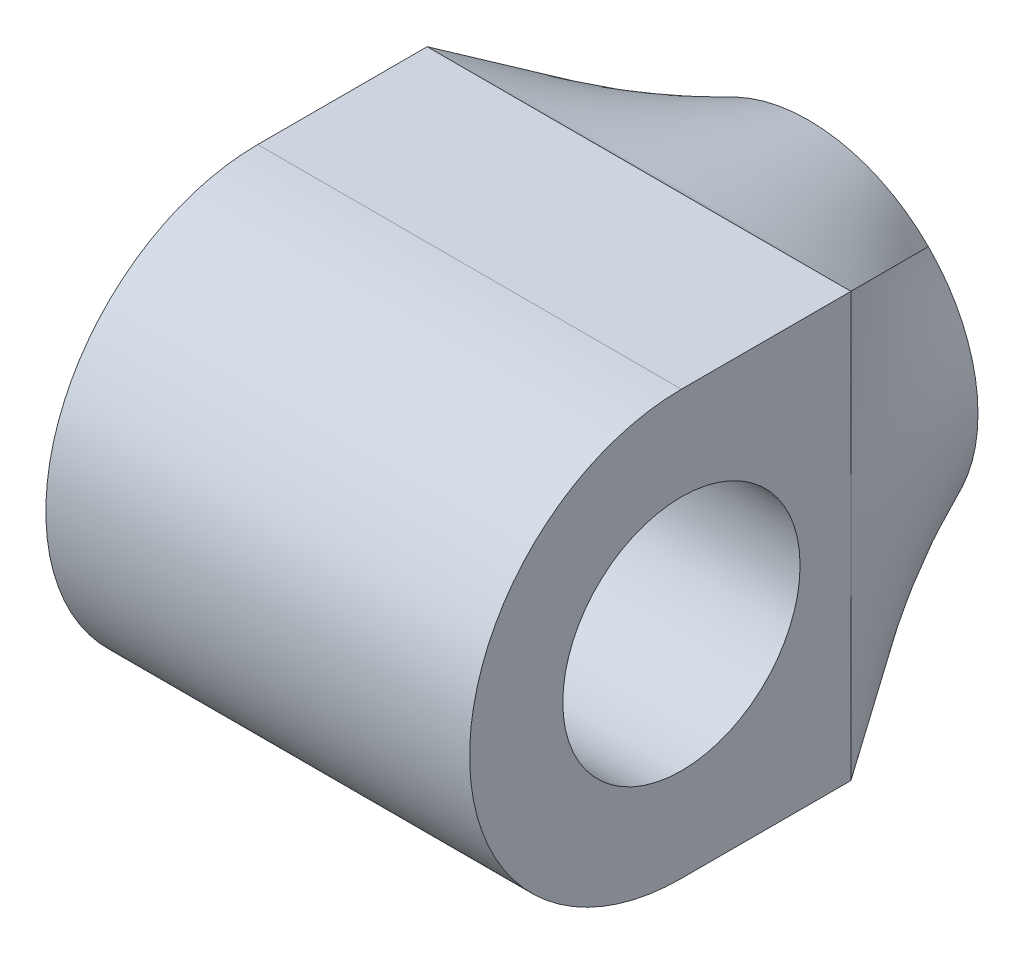
ISO-10303-21;
HEADER;
FILE_DESCRIPTION(('STEP AP214'),'2;1');
FILE_NAME('part.step','',(''),(''),'','','');
FILE_SCHEMA(('AUTOMOTIVE_DESIGN { 1 0 10303 214 1 1 1 1 }'));
ENDSEC;
DATA;
#1=APPLICATION_CONTEXT('core data for automotive mechanical design processes');
#2=APPLICATION_PROTOCOL_DEFINITION('international standard','automotive_design',2000,#1);
#3=PRODUCT_CONTEXT('',#1,'mechanical');
#4=PRODUCT('Part','Part','',(#3));
#5=PRODUCT_RELATED_PRODUCT_CATEGORY('part','',(#4));
#6=PRODUCT_DEFINITION_FORMATION('','',#4);
#7=PRODUCT_DEFINITION_CONTEXT('part definition',#1,'design');
#8=PRODUCT_DEFINITION('design','',#6,#7);
#9=PRODUCT_DEFINITION_SHAPE('','',#8);
#10=(LENGTH_UNIT() NAMED_UNIT(*) SI_UNIT(.MILLI.,.METRE.));
#11=(NAMED_UNIT(*) PLANE_ANGLE_UNIT() SI_UNIT($,.RADIAN.));
#12=(NAMED_UNIT(*) SI_UNIT($,.STERADIAN.) SOLID_ANGLE_UNIT());
#13=UNCERTAINTY_MEASURE_WITH_UNIT(LENGTH_MEASURE(1.E-05),#10,'distance_accuracy_value','');
#14=(GEOMETRIC_REPRESENTATION_CONTEXT(3) GLOBAL_UNCERTAINTY_ASSIGNED_CONTEXT((#13)) GLOBAL_UNIT_ASSIGNED_CONTEXT((#10,
#11,#12)) REPRESENTATION_CONTEXT('',''));
#15=CARTESIAN_POINT('',(0.,0.,0.));
#16=DIRECTION('',(0.,0.,1.));
#17=DIRECTION('',(1.,0.,0.));
#18=AXIS2_PLACEMENT_3D('',#15,#16,#17);
#19=CARTESIAN_POINT('',(0.,0.,0.));
#20=DIRECTION('',(0.,0.,1.));
#21=DIRECTION('',(1.,0.,0.));
#22=AXIS2_PLACEMENT_3D('',#19,#20,#21);
#23=PLANE('',#22);
#24=CARTESIAN_POINT('',(0.,0.,0.));
#25=DIRECTION('',(0.,0.,1.));
#26=DIRECTION('',(1.,0.,0.));
#27=AXIS2_PLACEMENT_3D('',#24,#25,#26);
#28=CIRCLE('',#27,10.);
#29=CARTESIAN_POINT('',(-7.07106781186548,-7.07106781186548,0.));
#30=VERTEX_POINT('',#29);
#31=CARTESIAN_POINT('',(7.07106781186547,-7.07106781186548,0.));
#32=VERTEX_POINT('',#31);
#33=EDGE_CURVE('E12',#30,#32,#28,.T.);
#34=ORIENTED_EDGE('',*,*,#33,.F.);
#35=CARTESIAN_POINT('',(-7.07106781186548,7.07106781186548,0.));
#36=VERTEX_POINT('',#35);
#37=EDGE_CURVE('E279',#36,#30,#28,.T.);
#38=ORIENTED_EDGE('',*,*,#37,.F.);
#39=CARTESIAN_POINT('',(7.07106781186548,7.07106781186548,0.));
#40=VERTEX_POINT('',#39);
#41=EDGE_CURVE('E281',#40,#36,#28,.T.);
#42=ORIENTED_EDGE('',*,*,#41,.F.);
#43=EDGE_CURVE('E80',#32,#40,#28,.T.);
#44=ORIENTED_EDGE('',*,*,#43,.F.);
#45=EDGE_LOOP('',(#34,#38,#42,#44));
#46=FACE_BOUND('',#45,.T.);
#47=ADVANCED_FACE('F70',(#46),#23,.F.);
#48=CARTESIAN_POINT('',(-12.5,12.5,10.));
#49=CARTESIAN_POINT('',(-7.07106781186548,7.07106781186548,0.));
#50=CARTESIAN_POINT('',(-11.4583333333333,12.5,10.));
#51=CARTESIAN_POINT('',(-6.65440114519881,7.48773447853214,0.));
#52=CARTESIAN_POINT('',(-10.4166666666667,12.5,10.));
#53=CARTESIAN_POINT('',(-6.18511190982561,7.88294229636119,0.));
#54=CARTESIAN_POINT('',(-8.33333333333333,12.5,10.));
#55=CARTESIAN_POINT('',(-5.1475798041437,8.59644174904935,0.));
#56=CARTESIAN_POINT('',(-7.29166666666666,12.5,10.));
#57=CARTESIAN_POINT('',(-4.57928394964498,8.91450237104858,0.));
#58=CARTESIAN_POINT('',(-5.20833333333333,12.5,10.));
#59=CARTESIAN_POINT('',(-3.36426300033644,9.44033518893656,0.));
#60=CARTESIAN_POINT('',(-4.16666666666666,12.5,10.));
#61=CARTESIAN_POINT('',(-2.71763303055414,9.64784964914939,0.));
#62=CARTESIAN_POINT('',(-2.08333333333333,12.5,10.));
#63=CARTESIAN_POINT('',(-1.380556458553,9.92776893395985,0.));
#64=CARTESIAN_POINT('',(-1.04166666666666,12.5,10.));
#65=CARTESIAN_POINT('',(-0.690355937288492,10.,0.));
#66=CARTESIAN_POINT('',(1.04166666666667,12.5,10.));
#67=CARTESIAN_POINT('',(0.690355937288492,10.,0.));
#68=CARTESIAN_POINT('',(2.08333333333334,12.5,10.));
#69=CARTESIAN_POINT('',(1.380556458553,9.92776893395986,0.));
#70=CARTESIAN_POINT('',(4.16666666666667,12.5,10.));
#71=CARTESIAN_POINT('',(2.71763303055414,9.64784964914939,0.));
#72=CARTESIAN_POINT('',(5.20833333333334,12.5,10.));
#73=CARTESIAN_POINT('',(3.36426300033644,9.44033518893657,0.));
#74=CARTESIAN_POINT('',(7.29166666666667,12.5,10.));
#75=CARTESIAN_POINT('',(4.57928394964498,8.91450237104858,0.));
#76=CARTESIAN_POINT('',(8.33333333333334,12.5,10.));
#77=CARTESIAN_POINT('',(5.14757980414371,8.59644174904935,0.));
#78=CARTESIAN_POINT('',(10.4166666666667,12.5,10.));
#79=CARTESIAN_POINT('',(6.18511190982561,7.88294229636119,0.));
#80=CARTESIAN_POINT('',(11.4583333333333,12.5,10.));
#81=CARTESIAN_POINT('',(6.65440114519881,7.48773447853215,0.));
#82=CARTESIAN_POINT('',(12.5,12.5,10.));
#83=CARTESIAN_POINT('',(7.07106781186548,7.07106781186548,0.));
#84=B_SPLINE_SURFACE_WITH_KNOTS('',3,1,((#48,#49),(#50,#51),(#52,#53),(#54,#55),(#56,#57),(#58,
#59),(#60,#61),(#62,#63),(#64,#65),(#66,#67),(#68,#69),(#70,#71),(#72,#73),(#74,#75),(#76,#77),
(#78,#79),(#80,#81),(#82,#83)),.UNSPECIFIED.,.F.,.F.,.F.,(4,2,2,2,2,2,2,2,4),(2,2),(0.,0.125,
0.25,0.375,0.5,0.625,0.75,0.875,1.),(0.,1.),.UNSPECIFIED.);
#85=DIRECTION('',(-1.,0.,0.));
#86=VECTOR('',#85,1.);
#87=CARTESIAN_POINT('',(-12.5,12.5,10.));
#88=LINE('',#87,#86);
#89=CARTESIAN_POINT('',(12.5008428006911,12.5,10.));
#90=VERTEX_POINT('',#89);
#91=CARTESIAN_POINT('',(-12.5008428006911,12.5,10.));
#92=VERTEX_POINT('',#91);
#93=EDGE_CURVE('E149',#90,#92,#88,.T.);
#94=DIRECTION('',(-0.430614632146905,-0.430614632146906,-0.793184768614457));
#95=VECTOR('',#94,1.);
#96=CARTESIAN_POINT('',(9.78553390593274,9.78553390593274,5.));
#97=LINE('',#96,#95);
#98=EDGE_CURVE('E247',#90,#40,#97,.T.);
#99=DIRECTION('',(-0.430614632146906,0.430614632146906,0.793184768614457));
#100=VECTOR('',#99,1.);
#101=CARTESIAN_POINT('',(-9.78553390593274,9.78553390593274,5.));
#102=LINE('',#101,#100);
#103=EDGE_CURVE('E249',#36,#92,#102,.T.);
#104=CARTESIAN_POINT('',(-12.50105,12.5,10.));
#105=CARTESIAN_POINT('',(-7.07148781186548,7.07064781186548,0.));
#106=CARTESIAN_POINT('',(-12.5007,12.5,10.));
#107=CARTESIAN_POINT('',(-7.07134781186548,7.07078781186548,0.));
#108=CARTESIAN_POINT('',(-12.50035,12.5,10.));
#109=CARTESIAN_POINT('',(-7.07120781186548,7.07092781186548,0.));
#110=CARTESIAN_POINT('',(-12.5,12.5,10.));
#111=CARTESIAN_POINT('',(-7.07106781186548,7.07106781186548,0.));
#112=CARTESIAN_POINT('',(-11.4583333333333,12.5,10.));
#113=CARTESIAN_POINT('',(-6.65440114519881,7.48773447853214,0.));
#114=CARTESIAN_POINT('',(-10.4166666666667,12.5,10.));
#115=CARTESIAN_POINT('',(-6.18511190982561,7.88294229636119,0.));
#116=CARTESIAN_POINT('',(-8.33333333333333,12.5,10.));
#117=CARTESIAN_POINT('',(-5.1475798041437,8.59644174904935,0.));
#118=CARTESIAN_POINT('',(-7.29166666666666,12.5,10.));
#119=CARTESIAN_POINT('',(-4.57928394964498,8.91450237104858,0.));
#120=CARTESIAN_POINT('',(-5.20833333333333,12.5,10.));
#121=CARTESIAN_POINT('',(-3.36426300033644,9.44033518893656,0.));
#122=CARTESIAN_POINT('',(-4.16666666666666,12.5,10.));
#123=CARTESIAN_POINT('',(-2.71763303055414,9.64784964914939,0.));
#124=CARTESIAN_POINT('',(-2.08333333333333,12.5,10.));
#125=CARTESIAN_POINT('',(-1.380556458553,9.92776893395985,0.));
#126=CARTESIAN_POINT('',(-1.04166666666666,12.5,10.));
#127=CARTESIAN_POINT('',(-0.690355937288492,10.,0.));
#128=CARTESIAN_POINT('',(1.04166666666667,12.5,10.));
#129=CARTESIAN_POINT('',(0.690355937288492,10.,0.));
#130=CARTESIAN_POINT('',(2.08333333333334,12.5,10.));
#131=CARTESIAN_POINT('',(1.380556458553,9.92776893395986,0.));
#132=CARTESIAN_POINT('',(4.16666666666667,12.5,10.));
#133=CARTESIAN_POINT('',(2.71763303055414,9.64784964914939,0.));
#134=CARTESIAN_POINT('',(5.20833333333334,12.5,10.));
#135=CARTESIAN_POINT('',(3.36426300033644,9.44033518893657,0.));
#136=CARTESIAN_POINT('',(7.29166666666667,12.5,10.));
#137=CARTESIAN_POINT('',(4.57928394964498,8.91450237104858,0.));
#138=CARTESIAN_POINT('',(8.33333333333334,12.5,10.));
#139=CARTESIAN_POINT('',(5.14757980414371,8.59644174904935,0.));
#140=CARTESIAN_POINT('',(10.4166666666667,12.5,10.));
#141=CARTESIAN_POINT('',(6.18511190982561,7.88294229636119,0.));
#142=CARTESIAN_POINT('',(11.4583333333333,12.5,10.));
#143=CARTESIAN_POINT('',(6.65440114519881,7.48773447853215,0.));
#144=CARTESIAN_POINT('',(12.5,12.5,10.));
#145=CARTESIAN_POINT('',(7.07106781186548,7.07106781186548,0.));
#146=CARTESIAN_POINT('',(12.50035,12.5,10.));
#147=CARTESIAN_POINT('',(7.07120781186548,7.07092781186548,0.));
#148=CARTESIAN_POINT('',(12.5007,12.5,10.));
#149=CARTESIAN_POINT('',(7.07134781186548,7.07078781186548,0.));
#150=CARTESIAN_POINT('',(12.50105,12.5,10.));
#151=CARTESIAN_POINT('',(7.07148781186548,7.07064781186548,0.));
#152=B_SPLINE_SURFACE_WITH_KNOTS('',3,1,((#104,#105),(#106,#107),(#108,#109),(#110,#111),(#112,
#113),(#114,#115),(#116,#117),(#118,#119),(#120,#121),(#122,#123),(#124,#125),(#126,#127),(#128,
#129),(#130,#131),(#132,#133),(#134,#135),(#136,#137),(#138,#139),(#140,#141),(#142,#143),(#144,
#145),(#146,#147),(#148,#149),(#150,#151)),.UNSPECIFIED.,.F.,.F.,.F.,(4,3,2,2,2,2,2,2,2,3,4),(2,
2),(-4.2E-05,0.,0.125,0.25,0.375,0.5,0.625,0.75,0.875,1.,1.000042),(0.,1.),.UNSPECIFIED.);
#153=ORIENTED_EDGE('',*,*,#93,.F.);
#154=ORIENTED_EDGE('',*,*,#98,.T.);
#155=ORIENTED_EDGE('',*,*,#41,.T.);
#156=ORIENTED_EDGE('',*,*,#103,.T.);
#157=EDGE_LOOP('',(#153,#154,#155,#156));
#158=FACE_BOUND('',#157,.T.);
#159=ADVANCED_FACE('F223',(#158),#152,.T.);
#160=CARTESIAN_POINT('',(12.5,12.5,10.));
#161=CARTESIAN_POINT('',(7.07106781186548,7.07106781186548,0.));
#162=CARTESIAN_POINT('',(12.5,11.4583333333333,10.));
#163=CARTESIAN_POINT('',(7.48773447853215,6.65440114519881,0.));
#164=CARTESIAN_POINT('',(12.5,10.4166666666667,10.));
#165=CARTESIAN_POINT('',(7.8829422963612,6.18511190982561,0.));
#166=CARTESIAN_POINT('',(12.5,8.33333333333334,10.));
#167=CARTESIAN_POINT('',(8.59644174904935,5.14757980414371,0.));
#168=CARTESIAN_POINT('',(12.5,7.29166666666667,10.));
#169=CARTESIAN_POINT('',(8.91450237104858,4.57928394964498,0.));
#170=CARTESIAN_POINT('',(12.5,5.20833333333334,10.));
#171=CARTESIAN_POINT('',(9.44033518893657,3.36426300033644,0.));
#172=CARTESIAN_POINT('',(12.5,4.16666666666667,10.));
#173=CARTESIAN_POINT('',(9.64784964914938,2.71763303055414,0.));
#174=CARTESIAN_POINT('',(12.5,2.08333333333334,10.));
#175=CARTESIAN_POINT('',(9.92776893395985,1.380556458553,0.));
#176=CARTESIAN_POINT('',(12.5,1.04166666666667,10.));
#177=CARTESIAN_POINT('',(10.,0.690355937288491,0.));
#178=CARTESIAN_POINT('',(12.5,-1.04166666666667,10.));
#179=CARTESIAN_POINT('',(10.,-0.690355937288493,0.));
#180=CARTESIAN_POINT('',(12.5,-2.08333333333333,10.));
#181=CARTESIAN_POINT('',(9.92776893395985,-1.380556458553,0.));
#182=CARTESIAN_POINT('',(12.5,-4.16666666666666,10.));
#183=CARTESIAN_POINT('',(9.64784964914938,-2.71763303055414,0.));
#184=CARTESIAN_POINT('',(12.5,-5.20833333333333,10.));
#185=CARTESIAN_POINT('',(9.44033518893656,-3.36426300033644,0.));
#186=CARTESIAN_POINT('',(12.5,-7.29166666666666,10.));
#187=CARTESIAN_POINT('',(8.91450237104857,-4.57928394964498,0.));
#188=CARTESIAN_POINT('',(12.5,-8.33333333333333,10.));
#189=CARTESIAN_POINT('',(8.59644174904935,-5.14757980414371,0.));
#190=CARTESIAN_POINT('',(12.5,-10.4166666666667,10.));
#191=CARTESIAN_POINT('',(7.88294229636119,-6.18511190982561,0.));
#192=CARTESIAN_POINT('',(12.5,-11.4583333333333,10.));
#193=CARTESIAN_POINT('',(7.48773447853214,-6.65440114519881,0.));
#194=CARTESIAN_POINT('',(12.5,-12.5,10.));
#195=CARTESIAN_POINT('',(7.07106781186547,-7.07106781186548,0.));
#196=B_SPLINE_SURFACE_WITH_KNOTS('',3,1,((#160,#161),(#162,#163),(#164,#165),(#166,#167),(#168,
#169),(#170,#171),(#172,#173),(#174,#175),(#176,#177),(#178,#179),(#180,#181),(#182,#183),(#184,
#185),(#186,#187),(#188,#189),(#190,#191),(#192,#193),(#194,#195)),.UNSPECIFIED.,.F.,.F.,.F.,(4,
2,2,2,2,2,2,2,4),(2,2),(0.,0.125,0.25,0.375,0.5,0.625,0.75,0.875,1.),(0.,1.),.UNSPECIFIED.);
#197=DIRECTION('',(0.,1.,0.));
#198=VECTOR('',#197,1.);
#199=CARTESIAN_POINT('',(12.5,-12.5,10.));
#200=LINE('',#199,#198);
#201=CARTESIAN_POINT('',(12.5008428006911,-12.5,10.));
#202=VERTEX_POINT('',#201);
#203=EDGE_CURVE('E74',#202,#90,#200,.T.);
#204=DIRECTION('',(-0.430614632146906,0.430614632146906,-0.793184768614457));
#205=VECTOR('',#204,1.);
#206=CARTESIAN_POINT('',(9.78553390593274,-9.78553390593274,5.));
#207=LINE('',#206,#205);
#208=EDGE_CURVE('E88',#202,#32,#207,.T.);
#209=ORIENTED_EDGE('',*,*,#203,.F.);
#210=ORIENTED_EDGE('',*,*,#208,.T.);
#211=ORIENTED_EDGE('',*,*,#43,.T.);
#212=ORIENTED_EDGE('',*,*,#98,.F.);
#213=EDGE_LOOP('',(#209,#210,#211,#212));
#214=FACE_BOUND('',#213,.T.);
#215=ADVANCED_FACE('F212',(#214),#196,.T.);
#216=CARTESIAN_POINT('',(-12.5,-12.5,10.));
#217=CARTESIAN_POINT('',(-7.07106781186548,-7.07106781186548,0.));
#218=CARTESIAN_POINT('',(-12.5,-11.4583333333333,10.));
#219=CARTESIAN_POINT('',(-7.48773447853215,-6.65440114519881,0.));
#220=CARTESIAN_POINT('',(-12.5,-10.4166666666667,10.));
#221=CARTESIAN_POINT('',(-7.88294229636119,-6.18511190982561,0.));
#222=CARTESIAN_POINT('',(-12.5,-8.33333333333333,10.));
#223=CARTESIAN_POINT('',(-8.59644174904935,-5.1475798041437,0.));
#224=CARTESIAN_POINT('',(-12.5,-7.29166666666666,10.));
#225=CARTESIAN_POINT('',(-8.91450237104857,-4.57928394964498,0.));
#226=CARTESIAN_POINT('',(-12.5,-5.20833333333332,10.));
#227=CARTESIAN_POINT('',(-9.44033518893657,-3.36426300033644,0.));
#228=CARTESIAN_POINT('',(-12.5,-4.16666666666665,10.));
#229=CARTESIAN_POINT('',(-9.64784964914939,-2.71763303055414,0.));
#230=CARTESIAN_POINT('',(-12.5,-2.08333333333332,10.));
#231=CARTESIAN_POINT('',(-9.92776893395986,-1.380556458553,0.));
#232=CARTESIAN_POINT('',(-12.5,-1.04166666666665,10.));
#233=CARTESIAN_POINT('',(-10.,-0.690355937288491,0.));
#234=CARTESIAN_POINT('',(-12.5,1.04166666666668,10.));
#235=CARTESIAN_POINT('',(-10.,0.690355937288493,0.));
#236=CARTESIAN_POINT('',(-12.5,2.08333333333335,10.));
#237=CARTESIAN_POINT('',(-9.92776893395986,1.380556458553,0.));
#238=CARTESIAN_POINT('',(-12.5,4.16666666666668,10.));
#239=CARTESIAN_POINT('',(-9.64784964914939,2.71763303055414,0.));
#240=CARTESIAN_POINT('',(-12.5,5.20833333333334,10.));
#241=CARTESIAN_POINT('',(-9.44033518893657,3.36426300033644,0.));
#242=CARTESIAN_POINT('',(-12.5,7.29166666666667,10.));
#243=CARTESIAN_POINT('',(-8.91450237104857,4.57928394964498,0.));
#244=CARTESIAN_POINT('',(-12.5,8.33333333333334,10.));
#245=CARTESIAN_POINT('',(-8.59644174904935,5.1475798041437,0.));
#246=CARTESIAN_POINT('',(-12.5,10.4166666666667,10.));
#247=CARTESIAN_POINT('',(-7.88294229636119,6.18511190982561,0.));
#248=CARTESIAN_POINT('',(-12.5,11.4583333333333,10.));
#249=CARTESIAN_POINT('',(-7.48773447853214,6.65440114519881,0.));
#250=CARTESIAN_POINT('',(-12.5,12.5,10.));
#251=CARTESIAN_POINT('',(-7.07106781186548,7.07106781186548,0.));
#252=B_SPLINE_SURFACE_WITH_KNOTS('',3,1,((#216,#217),(#218,#219),(#220,#221),(#222,#223),(#224,
#225),(#226,#227),(#228,#229),(#230,#231),(#232,#233),(#234,#235),(#236,#237),(#238,#239),(#240,
#241),(#242,#243),(#244,#245),(#246,#247),(#248,#249),(#250,#251)),.UNSPECIFIED.,.F.,.F.,.F.,(4,
2,2,2,2,2,2,2,4),(2,2),(0.,0.125,0.25,0.375,0.5,0.625,0.75,0.875,1.),(0.,1.),.UNSPECIFIED.);
#253=DIRECTION('',(0.,-1.,0.));
#254=VECTOR('',#253,1.);
#255=CARTESIAN_POINT('',(-12.5,-12.5,10.));
#256=LINE('',#255,#254);
#257=CARTESIAN_POINT('',(-12.5008428006911,-12.5,10.));
#258=VERTEX_POINT('',#257);
#259=EDGE_CURVE('E275',#92,#258,#256,.T.);
#260=DIRECTION('',(0.430614632146906,0.430614632146906,-0.793184768614457));
#261=VECTOR('',#260,1.);
#262=CARTESIAN_POINT('',(-9.78553390593274,-9.78553390593274,5.));
#263=LINE('',#262,#261);
#264=EDGE_CURVE('E278',#258,#30,#263,.T.);
#265=ORIENTED_EDGE('',*,*,#259,.F.);
#266=ORIENTED_EDGE('',*,*,#103,.F.);
#267=ORIENTED_EDGE('',*,*,#37,.T.);
#268=ORIENTED_EDGE('',*,*,#264,.F.);
#269=EDGE_LOOP('',(#265,#266,#267,#268));
#270=FACE_BOUND('',#269,.T.);
#271=ADVANCED_FACE('F183',(#270),#252,.T.);
#272=CARTESIAN_POINT('',(12.5,-12.5,10.));
#273=CARTESIAN_POINT('',(7.07106781186547,-7.07106781186548,0.));
#274=CARTESIAN_POINT('',(11.4583333333333,-12.5,10.));
#275=CARTESIAN_POINT('',(6.65440114519881,-7.48773447853215,0.));
#276=CARTESIAN_POINT('',(10.4166666666667,-12.5,10.));
#277=CARTESIAN_POINT('',(6.1851119098256,-7.88294229636119,0.));
#278=CARTESIAN_POINT('',(8.33333333333332,-12.5,10.));
#279=CARTESIAN_POINT('',(5.1475798041437,-8.59644174904935,0.));
#280=CARTESIAN_POINT('',(7.29166666666665,-12.5,10.));
#281=CARTESIAN_POINT('',(4.57928394964497,-8.91450237104857,0.));
#282=CARTESIAN_POINT('',(5.20833333333331,-12.5,10.));
#283=CARTESIAN_POINT('',(3.36426300033644,-9.44033518893657,0.));
#284=CARTESIAN_POINT('',(4.16666666666664,-12.5,10.));
#285=CARTESIAN_POINT('',(2.71763303055414,-9.64784964914939,0.));
#286=CARTESIAN_POINT('',(2.08333333333331,-12.5,10.));
#287=CARTESIAN_POINT('',(1.38055645855299,-9.92776893395986,0.));
#288=CARTESIAN_POINT('',(1.04166666666665,-12.5,10.));
#289=CARTESIAN_POINT('',(0.69035593728849,-10.,0.));
#290=CARTESIAN_POINT('',(-1.04166666666668,-12.5,10.));
#291=CARTESIAN_POINT('',(-0.690355937288494,-10.,0.));
#292=CARTESIAN_POINT('',(-2.08333333333335,-12.5,10.));
#293=CARTESIAN_POINT('',(-1.380556458553,-9.92776893395986,0.));
#294=CARTESIAN_POINT('',(-4.16666666666668,-12.5,10.));
#295=CARTESIAN_POINT('',(-2.71763303055414,-9.64784964914938,0.));
#296=CARTESIAN_POINT('',(-5.20833333333334,-12.5,10.));
#297=CARTESIAN_POINT('',(-3.36426300033644,-9.44033518893657,0.));
#298=CARTESIAN_POINT('',(-7.29166666666667,-12.5,10.));
#299=CARTESIAN_POINT('',(-4.57928394964498,-8.91450237104857,0.));
#300=CARTESIAN_POINT('',(-8.33333333333334,-12.5,10.));
#301=CARTESIAN_POINT('',(-5.1475798041437,-8.59644174904935,0.));
#302=CARTESIAN_POINT('',(-10.4166666666667,-12.5,10.));
#303=CARTESIAN_POINT('',(-6.18511190982561,-7.88294229636119,0.));
#304=CARTESIAN_POINT('',(-11.4583333333333,-12.5,10.));
#305=CARTESIAN_POINT('',(-6.65440114519881,-7.48773447853214,0.));
#306=CARTESIAN_POINT('',(-12.5,-12.5,10.));
#307=CARTESIAN_POINT('',(-7.07106781186548,-7.07106781186548,0.));
#308=B_SPLINE_SURFACE_WITH_KNOTS('',3,1,((#272,#273),(#274,#275),(#276,#277),(#278,#279),(#280,
#281),(#282,#283),(#284,#285),(#286,#287),(#288,#289),(#290,#291),(#292,#293),(#294,#295),(#296,
#297),(#298,#299),(#300,#301),(#302,#303),(#304,#305),(#306,#307)),.UNSPECIFIED.,.F.,.F.,.F.,(4,
2,2,2,2,2,2,2,4),(2,2),(0.,0.125,0.25,0.375,0.5,0.625,0.75,0.875,1.),(0.,1.),.UNSPECIFIED.);
#309=DIRECTION('',(1.,0.,0.));
#310=VECTOR('',#309,1.);
#311=CARTESIAN_POINT('',(-12.5,-12.5,10.));
#312=LINE('',#311,#310);
#313=EDGE_CURVE('E167',#258,#202,#312,.T.);
#314=CARTESIAN_POINT('',(12.50105,-12.5,10.));
#315=CARTESIAN_POINT('',(7.07148781186547,-7.07064781186548,0.));
#316=CARTESIAN_POINT('',(12.5007,-12.5,10.));
#317=CARTESIAN_POINT('',(7.07134781186547,-7.07078781186548,0.));
#318=CARTESIAN_POINT('',(12.50035,-12.5,10.));
#319=CARTESIAN_POINT('',(7.07120781186547,-7.07092781186548,0.));
#320=CARTESIAN_POINT('',(12.5,-12.5,10.));
#321=CARTESIAN_POINT('',(7.07106781186547,-7.07106781186548,0.));
#322=CARTESIAN_POINT('',(11.4583333333333,-12.5,10.));
#323=CARTESIAN_POINT('',(6.65440114519881,-7.48773447853215,0.));
#324=CARTESIAN_POINT('',(10.4166666666667,-12.5,10.));
#325=CARTESIAN_POINT('',(6.1851119098256,-7.88294229636119,0.));
#326=CARTESIAN_POINT('',(8.33333333333332,-12.5,10.));
#327=CARTESIAN_POINT('',(5.1475798041437,-8.59644174904935,0.));
#328=CARTESIAN_POINT('',(7.29166666666665,-12.5,10.));
#329=CARTESIAN_POINT('',(4.57928394964497,-8.91450237104857,0.));
#330=CARTESIAN_POINT('',(5.20833333333331,-12.5,10.));
#331=CARTESIAN_POINT('',(3.36426300033644,-9.44033518893657,0.));
#332=CARTESIAN_POINT('',(4.16666666666664,-12.5,10.));
#333=CARTESIAN_POINT('',(2.71763303055414,-9.64784964914939,0.));
#334=CARTESIAN_POINT('',(2.08333333333331,-12.5,10.));
#335=CARTESIAN_POINT('',(1.38055645855299,-9.92776893395986,0.));
#336=CARTESIAN_POINT('',(1.04166666666665,-12.5,10.));
#337=CARTESIAN_POINT('',(0.69035593728849,-10.,0.));
#338=CARTESIAN_POINT('',(-1.04166666666668,-12.5,10.));
#339=CARTESIAN_POINT('',(-0.690355937288494,-10.,0.));
#340=CARTESIAN_POINT('',(-2.08333333333335,-12.5,10.));
#341=CARTESIAN_POINT('',(-1.380556458553,-9.92776893395986,0.));
#342=CARTESIAN_POINT('',(-4.16666666666668,-12.5,10.));
#343=CARTESIAN_POINT('',(-2.71763303055414,-9.64784964914938,0.));
#344=CARTESIAN_POINT('',(-5.20833333333334,-12.5,10.));
#345=CARTESIAN_POINT('',(-3.36426300033644,-9.44033518893657,0.));
#346=CARTESIAN_POINT('',(-7.29166666666667,-12.5,10.));
#347=CARTESIAN_POINT('',(-4.57928394964498,-8.91450237104857,0.));
#348=CARTESIAN_POINT('',(-8.33333333333334,-12.5,10.));
#349=CARTESIAN_POINT('',(-5.1475798041437,-8.59644174904935,0.));
#350=CARTESIAN_POINT('',(-10.4166666666667,-12.5,10.));
#351=CARTESIAN_POINT('',(-6.18511190982561,-7.88294229636119,0.));
#352=CARTESIAN_POINT('',(-11.4583333333333,-12.5,10.));
#353=CARTESIAN_POINT('',(-6.65440114519881,-7.48773447853214,0.));
#354=CARTESIAN_POINT('',(-12.5,-12.5,10.));
#355=CARTESIAN_POINT('',(-7.07106781186548,-7.07106781186548,0.));
#356=CARTESIAN_POINT('',(-12.50035,-12.5,10.));
#357=CARTESIAN_POINT('',(-7.07120781186548,-7.07092781186548,0.));
#358=CARTESIAN_POINT('',(-12.5007,-12.5,10.));
#359=CARTESIAN_POINT('',(-7.07134781186548,-7.07078781186548,0.));
#360=CARTESIAN_POINT('',(-12.50105,-12.5,10.));
#361=CARTESIAN_POINT('',(-7.07148781186548,-7.07064781186548,0.));
#362=B_SPLINE_SURFACE_WITH_KNOTS('',3,1,((#314,#315),(#316,#317),(#318,#319),(#320,#321),(#322,
#323),(#324,#325),(#326,#327),(#328,#329),(#330,#331),(#332,#333),(#334,#335),(#336,#337),(#338,
#339),(#340,#341),(#342,#343),(#344,#345),(#346,#347),(#348,#349),(#350,#351),(#352,#353),(#354,
#355),(#356,#357),(#358,#359),(#360,#361)),.UNSPECIFIED.,.F.,.F.,.F.,(4,3,2,2,2,2,2,2,2,3,4),(2,
2),(-4.2E-05,0.,0.125,0.25,0.375,0.5,0.625,0.75,0.875,1.,1.000042),(0.,1.),.UNSPECIFIED.);
#363=ORIENTED_EDGE('',*,*,#313,.F.);
#364=ORIENTED_EDGE('',*,*,#264,.T.);
#365=ORIENTED_EDGE('',*,*,#33,.T.);
#366=ORIENTED_EDGE('',*,*,#208,.F.);
#367=EDGE_LOOP('',(#363,#364,#365,#366));
#368=FACE_BOUND('',#367,.T.);
#369=ADVANCED_FACE('F172',(#368),#362,.T.);
#370=CARTESIAN_POINT('',(12.5016856013822,12.5,10.));
#371=DIRECTION('',(0.,-1.,0.));
#372=DIRECTION('',(0.,0.,-1.));
#373=AXIS2_PLACEMENT_3D('',#370,#371,#372);
#374=PLANE('',#373);
#375=ORIENTED_EDGE('',*,*,#93,.T.);
#376=DIRECTION('',(0.,0.,1.));
#377=VECTOR('',#376,1.);
#378=CARTESIAN_POINT('',(-12.5016856013822,12.5,10.));
#379=LINE('',#378,#377);
#380=CARTESIAN_POINT('',(-12.5016856013822,12.5,20.));
#381=VERTEX_POINT('',#380);
#382=EDGE_CURVE('E143',#92,#381,#379,.T.);
#383=ORIENTED_EDGE('',*,*,#382,.T.);
#384=DIRECTION('',(-1.,0.,0.));
#385=VECTOR('',#384,1.);
#386=CARTESIAN_POINT('',(12.5016856013822,12.5,20.));
#387=LINE('',#386,#385);
#388=CARTESIAN_POINT('',(12.5016856013822,12.5,20.));
#389=VERTEX_POINT('',#388);
#390=EDGE_CURVE('E127',#389,#381,#387,.T.);
#391=ORIENTED_EDGE('',*,*,#390,.F.);
#392=DIRECTION('',(0.,0.,1.));
#393=VECTOR('',#392,1.);
#394=CARTESIAN_POINT('',(12.5016856013822,12.5,10.));
#395=LINE('',#394,#393);
#396=EDGE_CURVE('E363',#90,#389,#395,.T.);
#397=ORIENTED_EDGE('',*,*,#396,.F.);
#398=EDGE_LOOP('',(#375,#383,#391,#397));
#399=FACE_BOUND('',#398,.T.);
#400=ADVANCED_FACE('F148',(#399),#374,.F.);
#401=CARTESIAN_POINT('',(12.5016856013822,0.,20.));
#402=DIRECTION('',(-1.,0.,0.));
#403=DIRECTION('',(0.,0.,1.));
#404=AXIS2_PLACEMENT_3D('',#401,#402,#403);
#405=CYLINDRICAL_SURFACE('',#404,12.5);
#406=ORIENTED_EDGE('',*,*,#390,.T.);
#407=CARTESIAN_POINT('',(-12.5016856013822,0.,20.));
#408=DIRECTION('',(1.,0.,0.));
#409=DIRECTION('',(0.,0.,-1.));
#410=AXIS2_PLACEMENT_3D('',#407,#408,#409);
#411=CIRCLE('',#410,12.5);
#412=CARTESIAN_POINT('',(-12.5016856013822,-12.5,20.));
#413=VERTEX_POINT('',#412);
#414=EDGE_CURVE('E131',#381,#413,#411,.T.);
#415=ORIENTED_EDGE('',*,*,#414,.T.);
#416=DIRECTION('',(-1.,0.,0.));
#417=VECTOR('',#416,1.);
#418=CARTESIAN_POINT('',(12.5016856013822,-12.5,20.));
#419=LINE('',#418,#417);
#420=CARTESIAN_POINT('',(12.5016856013822,-12.5,20.));
#421=VERTEX_POINT('',#420);
#422=EDGE_CURVE('E137',#421,#413,#419,.T.);
#423=ORIENTED_EDGE('',*,*,#422,.F.);
#424=CARTESIAN_POINT('',(12.5016856013822,0.,20.));
#425=DIRECTION('',(1.,0.,0.));
#426=DIRECTION('',(0.,0.,-1.));
#427=AXIS2_PLACEMENT_3D('',#424,#425,#426);
#428=CIRCLE('',#427,12.5);
#429=EDGE_CURVE('E133',#389,#421,#428,.T.);
#430=ORIENTED_EDGE('',*,*,#429,.F.);
#431=EDGE_LOOP('',(#406,#415,#423,#430));
#432=FACE_BOUND('',#431,.T.);
#433=ADVANCED_FACE('F129',(#432),#405,.T.);
#434=CARTESIAN_POINT('',(12.5016856013822,-12.5,20.));
#435=DIRECTION('',(0.,1.,0.));
#436=DIRECTION('',(0.,0.,1.));
#437=AXIS2_PLACEMENT_3D('',#434,#435,#436);
#438=PLANE('',#437);
#439=ORIENTED_EDGE('',*,*,#422,.T.);
#440=DIRECTION('',(0.,0.,-1.));
#441=VECTOR('',#440,1.);
#442=CARTESIAN_POINT('',(-12.5016856013822,-12.5,20.));
#443=LINE('',#442,#441);
#444=EDGE_CURVE('E145',#413,#258,#443,.T.);
#445=ORIENTED_EDGE('',*,*,#444,.T.);
#446=ORIENTED_EDGE('',*,*,#313,.T.);
#447=DIRECTION('',(0.,0.,-1.));
#448=VECTOR('',#447,1.);
#449=CARTESIAN_POINT('',(12.5016856013822,-12.5,20.));
#450=LINE('',#449,#448);
#451=EDGE_CURVE('E481',#421,#202,#450,.T.);
#452=ORIENTED_EDGE('',*,*,#451,.F.);
#453=EDGE_LOOP('',(#439,#445,#446,#452));
#454=FACE_BOUND('',#453,.T.);
#455=ADVANCED_FACE('F332',(#454),#438,.F.);
#456=CARTESIAN_POINT('',(12.5016856013822,0.,20.));
#457=DIRECTION('',(1.,0.,0.));
#458=DIRECTION('',(0.,0.,-1.));
#459=AXIS2_PLACEMENT_3D('',#456,#457,#458);
#460=PLANE('',#459);
#461=CARTESIAN_POINT('',(12.5016856013822,0.,20.));
#462=DIRECTION('',(1.,0.,0.));
#463=DIRECTION('',(0.,0.,-1.));
#464=AXIS2_PLACEMENT_3D('',#461,#462,#463);
#465=CIRCLE('',#464,7.);
#466=CARTESIAN_POINT('',(12.5016856013822,0.,13.));
#467=VERTEX_POINT('',#466);
#468=EDGE_CURVE('E154',#467,#467,#465,.T.);
#469=ORIENTED_EDGE('',*,*,#468,.F.);
#470=EDGE_LOOP('',(#469));
#471=FACE_BOUND('',#470,.T.);
#472=ORIENTED_EDGE('',*,*,#203,.T.);
#473=ORIENTED_EDGE('',*,*,#396,.T.);
#474=ORIENTED_EDGE('',*,*,#429,.T.);
#475=ORIENTED_EDGE('',*,*,#451,.T.);
#476=EDGE_LOOP('',(#472,#473,#474,#475));
#477=FACE_BOUND('',#476,.T.);
#478=ADVANCED_FACE('F342',(#471,#477),#460,.T.);
#479=CARTESIAN_POINT('',(-12.5016856013822,0.,20.));
#480=DIRECTION('',(1.,0.,0.));
#481=DIRECTION('',(0.,0.,-1.));
#482=AXIS2_PLACEMENT_3D('',#479,#480,#481);
#483=PLANE('',#482);
#484=ORIENTED_EDGE('',*,*,#259,.T.);
#485=ORIENTED_EDGE('',*,*,#444,.F.);
#486=ORIENTED_EDGE('',*,*,#414,.F.);
#487=ORIENTED_EDGE('',*,*,#382,.F.);
#488=EDGE_LOOP('',(#484,#485,#486,#487));
#489=FACE_BOUND('',#488,.T.);
#490=ADVANCED_FACE('F142',(#489),#483,.F.);
#491=CARTESIAN_POINT('',(2.50168560138224,0.,20.));
#492=DIRECTION('',(1.,0.,0.));
#493=DIRECTION('',(0.,0.,-1.));
#494=AXIS2_PLACEMENT_3D('',#491,#492,#493);
#495=CYLINDRICAL_SURFACE('',#494,7.);
#496=CARTESIAN_POINT('',(2.50168560138224,0.,20.));
#497=DIRECTION('',(1.,0.,0.));
#498=DIRECTION('',(0.,0.,-1.));
#499=AXIS2_PLACEMENT_3D('',#496,#497,#498);
#500=CIRCLE('',#499,7.);
#501=CARTESIAN_POINT('',(2.50168560138224,0.,13.));
#502=VERTEX_POINT('',#501);
#503=EDGE_CURVE('E151',#502,#502,#500,.T.);
#504=ORIENTED_EDGE('',*,*,#503,.F.);
#505=EDGE_LOOP('',(#504));
#506=FACE_BOUND('',#505,.T.);
#507=ORIENTED_EDGE('',*,*,#468,.T.);
#508=EDGE_LOOP('',(#507));
#509=FACE_BOUND('',#508,.T.);
#510=ADVANCED_FACE('F375',(#506,#509),#495,.F.);
#511=CARTESIAN_POINT('',(2.50168560138224,0.,20.));
#512=DIRECTION('',(1.,0.,0.));
#513=DIRECTION('',(0.,0.,-1.));
#514=AXIS2_PLACEMENT_3D('',#511,#512,#513);
#515=PLANE('',#514);
#516=ORIENTED_EDGE('',*,*,#503,.T.);
#517=EDGE_LOOP('',(#516));
#518=FACE_BOUND('',#517,.T.);
#519=ADVANCED_FACE('F378',(#518),#515,.T.);
#520=CLOSED_SHELL('',(#47,#159,#215,#271,#369,#400,#433,#455,#478,#490,#510,#519));
#521=MANIFOLD_SOLID_BREP('B2',#520);
#522=ADVANCED_BREP_SHAPE_REPRESENTATION('',(#18,#521),#14);
#523=SHAPE_DEFINITION_REPRESENTATION(#9,#522);
ENDSEC;
END-ISO-10303-21;
